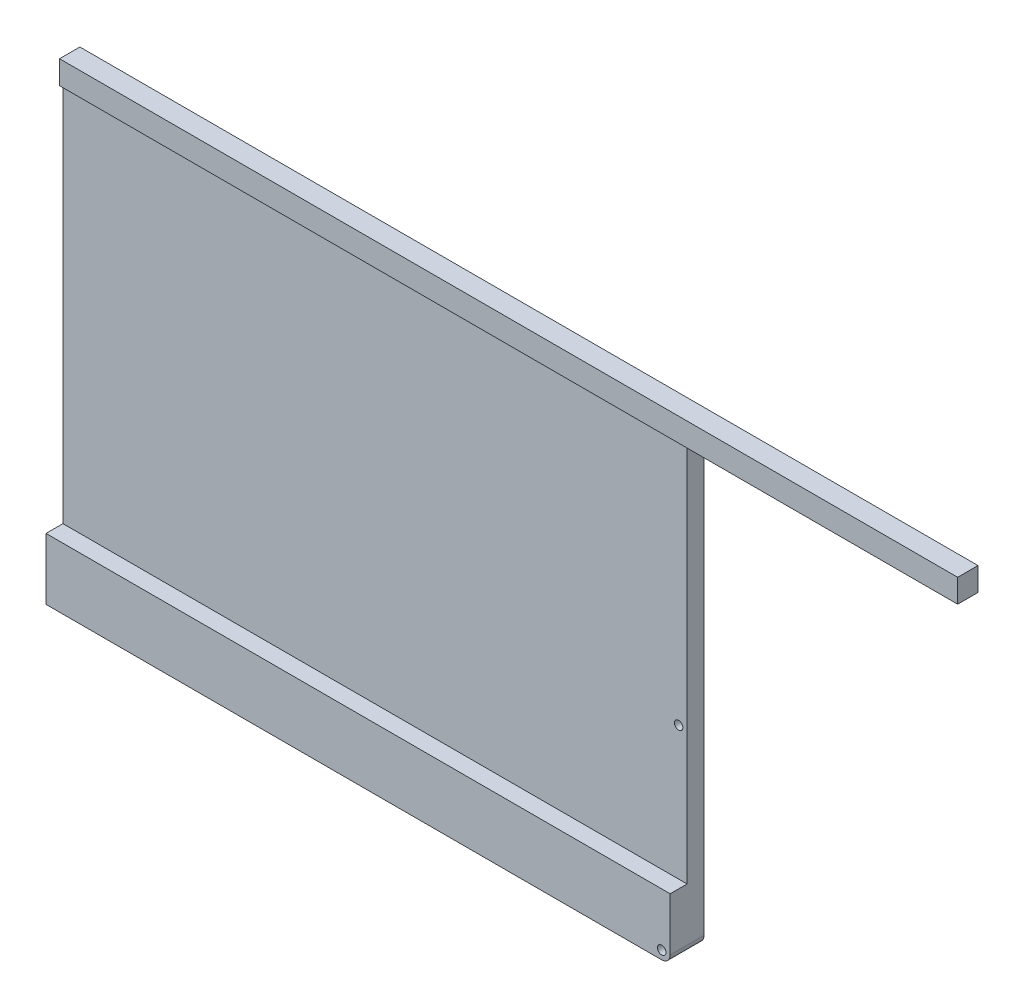
ISO-10303-21;
HEADER;
FILE_DESCRIPTION(('STEP AP214'),'2;1');
FILE_NAME('part.step','',(''),(''),'','','');
FILE_SCHEMA(('AUTOMOTIVE_DESIGN { 1 0 10303 214 1 1 1 1 }'));
ENDSEC;
DATA;
#1=APPLICATION_CONTEXT('core data for automotive mechanical design processes');
#2=APPLICATION_PROTOCOL_DEFINITION('international standard','automotive_design',2000,#1);
#3=PRODUCT_CONTEXT('',#1,'mechanical');
#4=PRODUCT('Part','Part','',(#3));
#5=PRODUCT_RELATED_PRODUCT_CATEGORY('part','',(#4));
#6=PRODUCT_DEFINITION_FORMATION('','',#4);
#7=PRODUCT_DEFINITION_CONTEXT('part definition',#1,'design');
#8=PRODUCT_DEFINITION('design','',#6,#7);
#9=PRODUCT_DEFINITION_SHAPE('','',#8);
#10=(LENGTH_UNIT() NAMED_UNIT(*) SI_UNIT(.MILLI.,.METRE.));
#11=(NAMED_UNIT(*) PLANE_ANGLE_UNIT() SI_UNIT($,.RADIAN.));
#12=(NAMED_UNIT(*) SI_UNIT($,.STERADIAN.) SOLID_ANGLE_UNIT());
#13=UNCERTAINTY_MEASURE_WITH_UNIT(LENGTH_MEASURE(1.E-05),#10,'distance_accuracy_value','');
#14=(GEOMETRIC_REPRESENTATION_CONTEXT(3) GLOBAL_UNCERTAINTY_ASSIGNED_CONTEXT((#13)) GLOBAL_UNIT_ASSIGNED_CONTEXT((#10,
#11,#12)) REPRESENTATION_CONTEXT('',''));
#15=CARTESIAN_POINT('',(0.,0.,0.));
#16=DIRECTION('',(0.,0.,1.));
#17=DIRECTION('',(1.,0.,0.));
#18=AXIS2_PLACEMENT_3D('',#15,#16,#17);
#19=CARTESIAN_POINT('',(0.,0.,0.));
#20=DIRECTION('',(0.,0.,1.));
#21=DIRECTION('',(1.,0.,0.));
#22=AXIS2_PLACEMENT_3D('',#19,#20,#21);
#23=PLANE('',#22);
#24=CARTESIAN_POINT('',(0.,110.,0.));
#25=DIRECTION('',(0.,0.,1.));
#26=DIRECTION('',(1.,0.,0.));
#27=AXIS2_PLACEMENT_3D('',#24,#25,#26);
#28=CIRCLE('',#27,2.5);
#29=CARTESIAN_POINT('',(2.5,110.,0.));
#30=VERTEX_POINT('',#29);
#31=EDGE_CURVE('E140',#30,#30,#28,.T.);
#32=ORIENTED_EDGE('',*,*,#31,.F.);
#33=EDGE_LOOP('',(#32));
#34=FACE_BOUND('',#33,.T.);
#35=DIRECTION('',(0.,-1.,0.));
#36=VECTOR('',#35,1.);
#37=CARTESIAN_POINT('',(-363.502125784835,270.,0.));
#38=LINE('',#37,#36);
#39=CARTESIAN_POINT('',(-363.502125784835,256.212106002811,0.));
#40=VERTEX_POINT('',#39);
#41=CARTESIAN_POINT('',(-363.502125784835,31.2917496201943,0.));
#42=VERTEX_POINT('',#41);
#43=EDGE_CURVE('E173',#40,#42,#38,.T.);
#44=ORIENTED_EDGE('',*,*,#43,.T.);
#45=DIRECTION('',(-1.,0.,0.));
#46=VECTOR('',#45,1.);
#47=CARTESIAN_POINT('',(-363.502125784835,31.2917496201943,0.));
#48=LINE('',#47,#46);
#49=CARTESIAN_POINT('',(4.99999999999998,31.2917496201943,0.));
#50=VERTEX_POINT('',#49);
#51=EDGE_CURVE('E138',#50,#42,#48,.T.);
#52=ORIENTED_EDGE('',*,*,#51,.F.);
#53=DIRECTION('',(0.,1.,0.));
#54=VECTOR('',#53,1.);
#55=CARTESIAN_POINT('',(5.00000000000005,256.212106002811,0.));
#56=LINE('',#55,#54);
#57=CARTESIAN_POINT('',(5.00000000000005,256.212106002811,0.));
#58=VERTEX_POINT('',#57);
#59=EDGE_CURVE('E168',#50,#58,#56,.T.);
#60=ORIENTED_EDGE('',*,*,#59,.T.);
#61=DIRECTION('',(1.,0.,0.));
#62=VECTOR('',#61,1.);
#63=CARTESIAN_POINT('',(-363.502125784835,256.212106002811,0.));
#64=LINE('',#63,#62);
#65=EDGE_CURVE('E60',#40,#58,#64,.T.);
#66=ORIENTED_EDGE('',*,*,#65,.F.);
#67=EDGE_LOOP('',(#44,#52,#60,#66));
#68=FACE_BOUND('',#67,.T.);
#69=ADVANCED_FACE('F35',(#34,#68),#23,.T.);
#70=CARTESIAN_POINT('',(0.,0.,-10.));
#71=DIRECTION('',(0.,0.,1.));
#72=DIRECTION('',(1.,0.,0.));
#73=AXIS2_PLACEMENT_3D('',#70,#71,#72);
#74=CYLINDRICAL_SURFACE('',#73,4.99999999999996);
#75=DIRECTION('',(0.,0.,1.));
#76=VECTOR('',#75,1.);
#77=CARTESIAN_POINT('',(4.99999999999996,0.,-10.));
#78=LINE('',#77,#76);
#79=CARTESIAN_POINT('',(4.99999999999996,0.,-10.));
#80=VERTEX_POINT('',#79);
#81=CARTESIAN_POINT('',(4.99999999999996,0.,10.));
#82=VERTEX_POINT('',#81);
#83=EDGE_CURVE('E188',#80,#82,#78,.T.);
#84=ORIENTED_EDGE('',*,*,#83,.T.);
#85=CARTESIAN_POINT('',(0.,0.,10.));
#86=DIRECTION('',(0.,0.,1.));
#87=DIRECTION('',(1.,0.,0.));
#88=AXIS2_PLACEMENT_3D('',#85,#86,#87);
#89=CIRCLE('',#88,4.99999999999996);
#90=CARTESIAN_POINT('',(0.,-4.99999999999998,10.));
#91=VERTEX_POINT('',#90);
#92=EDGE_CURVE('E133',#91,#82,#89,.T.);
#93=ORIENTED_EDGE('',*,*,#92,.F.);
#94=DIRECTION('',(0.,0.,1.));
#95=VECTOR('',#94,1.);
#96=CARTESIAN_POINT('',(0.,-4.99999999999998,-10.));
#97=LINE('',#96,#95);
#98=CARTESIAN_POINT('',(0.,-4.99999999999998,-10.));
#99=VERTEX_POINT('',#98);
#100=EDGE_CURVE('E11',#99,#91,#97,.T.);
#101=ORIENTED_EDGE('',*,*,#100,.F.);
#102=CARTESIAN_POINT('',(0.,0.,-10.));
#103=DIRECTION('',(0.,0.,1.));
#104=DIRECTION('',(1.,0.,0.));
#105=AXIS2_PLACEMENT_3D('',#102,#103,#104);
#106=CIRCLE('',#105,4.99999999999996);
#107=EDGE_CURVE('E169',#99,#80,#106,.T.);
#108=ORIENTED_EDGE('',*,*,#107,.T.);
#109=EDGE_LOOP('',(#84,#93,#101,#108));
#110=FACE_BOUND('',#109,.T.);
#111=ADVANCED_FACE('F37',(#110),#74,.T.);
#112=CARTESIAN_POINT('',(0.,-4.99999999999998,-10.));
#113=DIRECTION('',(0.,-1.,0.));
#114=DIRECTION('',(0.,0.,-1.));
#115=AXIS2_PLACEMENT_3D('',#112,#113,#114);
#116=PLANE('',#115);
#117=ORIENTED_EDGE('',*,*,#100,.T.);
#118=DIRECTION('',(1.,0.,0.));
#119=VECTOR('',#118,1.);
#120=CARTESIAN_POINT('',(0.,-4.99999999999998,10.));
#121=LINE('',#120,#119);
#122=CARTESIAN_POINT('',(-363.502125784835,-4.99999999999998,10.));
#123=VERTEX_POINT('',#122);
#124=EDGE_CURVE('E128',#123,#91,#121,.T.);
#125=ORIENTED_EDGE('',*,*,#124,.F.);
#126=DIRECTION('',(0.,0.,1.));
#127=VECTOR('',#126,1.);
#128=CARTESIAN_POINT('',(-363.502125784835,-4.99999999999998,-10.));
#129=LINE('',#128,#127);
#130=CARTESIAN_POINT('',(-363.502125784835,-4.99999999999998,-10.));
#131=VERTEX_POINT('',#130);
#132=EDGE_CURVE('E44',#131,#123,#129,.T.);
#133=ORIENTED_EDGE('',*,*,#132,.F.);
#134=DIRECTION('',(1.,0.,0.));
#135=VECTOR('',#134,1.);
#136=CARTESIAN_POINT('',(0.,-4.99999999999998,-10.));
#137=LINE('',#136,#135);
#138=EDGE_CURVE('E186',#131,#99,#137,.T.);
#139=ORIENTED_EDGE('',*,*,#138,.T.);
#140=EDGE_LOOP('',(#117,#125,#133,#139));
#141=FACE_BOUND('',#140,.T.);
#142=ADVANCED_FACE('F129',(#141),#116,.T.);
#143=CARTESIAN_POINT('',(-363.502125784835,270.,-10.));
#144=DIRECTION('',(-1.,0.,0.));
#145=DIRECTION('',(0.,-1.,0.));
#146=AXIS2_PLACEMENT_3D('',#143,#144,#145);
#147=PLANE('',#146);
#148=ORIENTED_EDGE('',*,*,#43,.F.);
#149=DIRECTION('',(0.,0.,-1.));
#150=VECTOR('',#149,1.);
#151=CARTESIAN_POINT('',(-363.502125784835,256.212106002811,2.));
#152=LINE('',#151,#150);
#153=CARTESIAN_POINT('',(-363.502125784835,256.212106002811,2.));
#154=VERTEX_POINT('',#153);
#155=EDGE_CURVE('E164',#154,#40,#152,.T.);
#156=ORIENTED_EDGE('',*,*,#155,.F.);
#157=DIRECTION('',(0.,-1.,0.));
#158=VECTOR('',#157,1.);
#159=CARTESIAN_POINT('',(-363.502125784835,256.212106002811,2.));
#160=LINE('',#159,#158);
#161=CARTESIAN_POINT('',(-363.502125784835,270.,2.));
#162=VERTEX_POINT('',#161);
#163=EDGE_CURVE('E152',#162,#154,#160,.T.);
#164=ORIENTED_EDGE('',*,*,#163,.F.);
#165=DIRECTION('',(0.,0.,1.));
#166=VECTOR('',#165,1.);
#167=CARTESIAN_POINT('',(-363.502125784835,270.,-10.));
#168=LINE('',#167,#166);
#169=CARTESIAN_POINT('',(-363.502125784835,270.,-10.));
#170=VERTEX_POINT('',#169);
#171=EDGE_CURVE('E125',#170,#162,#168,.T.);
#172=ORIENTED_EDGE('',*,*,#171,.F.);
#173=DIRECTION('',(0.,-1.,0.));
#174=VECTOR('',#173,1.);
#175=CARTESIAN_POINT('',(-363.502125784835,270.,-10.));
#176=LINE('',#175,#174);
#177=EDGE_CURVE('E121',#170,#131,#176,.T.);
#178=ORIENTED_EDGE('',*,*,#177,.T.);
#179=ORIENTED_EDGE('',*,*,#132,.T.);
#180=DIRECTION('',(0.,-1.,0.));
#181=VECTOR('',#180,1.);
#182=CARTESIAN_POINT('',(-363.502125784835,-4.99999999999998,10.));
#183=LINE('',#182,#181);
#184=CARTESIAN_POINT('',(-363.502125784835,31.2917496201943,10.));
#185=VERTEX_POINT('',#184);
#186=EDGE_CURVE('E119',#185,#123,#183,.T.);
#187=ORIENTED_EDGE('',*,*,#186,.F.);
#188=DIRECTION('',(0.,0.,-1.));
#189=VECTOR('',#188,1.);
#190=CARTESIAN_POINT('',(-363.502125784835,31.2917496201943,10.));
#191=LINE('',#190,#189);
#192=EDGE_CURVE('E148',#185,#42,#191,.T.);
#193=ORIENTED_EDGE('',*,*,#192,.T.);
#194=EDGE_LOOP('',(#148,#156,#164,#172,#178,#179,#187,#193));
#195=FACE_BOUND('',#194,.T.);
#196=ADVANCED_FACE('F116',(#195),#147,.T.);
#197=CARTESIAN_POINT('',(166.756532298693,270.,-10.));
#198=DIRECTION('',(0.,1.,0.));
#199=DIRECTION('',(0.,0.,1.));
#200=AXIS2_PLACEMENT_3D('',#197,#198,#199);
#201=PLANE('',#200);
#202=ORIENTED_EDGE('',*,*,#171,.T.);
#203=DIRECTION('',(-1.,0.,0.));
#204=VECTOR('',#203,1.);
#205=CARTESIAN_POINT('',(-363.502125784835,270.,2.));
#206=LINE('',#205,#204);
#207=CARTESIAN_POINT('',(166.756532298693,270.,2.));
#208=VERTEX_POINT('',#207);
#209=EDGE_CURVE('E161',#208,#162,#206,.T.);
#210=ORIENTED_EDGE('',*,*,#209,.F.);
#211=DIRECTION('',(0.,0.,1.));
#212=VECTOR('',#211,1.);
#213=CARTESIAN_POINT('',(166.756532298693,270.,-10.));
#214=LINE('',#213,#212);
#215=CARTESIAN_POINT('',(166.756532298693,270.,-10.));
#216=VERTEX_POINT('',#215);
#217=EDGE_CURVE('E192',#216,#208,#214,.T.);
#218=ORIENTED_EDGE('',*,*,#217,.F.);
#219=DIRECTION('',(-1.,0.,0.));
#220=VECTOR('',#219,1.);
#221=CARTESIAN_POINT('',(166.756532298693,270.,-10.));
#222=LINE('',#221,#220);
#223=EDGE_CURVE('E182',#216,#170,#222,.T.);
#224=ORIENTED_EDGE('',*,*,#223,.T.);
#225=EDGE_LOOP('',(#202,#210,#218,#224));
#226=FACE_BOUND('',#225,.T.);
#227=ADVANCED_FACE('F216',(#226),#201,.T.);
#228=CARTESIAN_POINT('',(166.756532298693,270.,-10.));
#229=DIRECTION('',(1.,0.,0.));
#230=DIRECTION('',(0.,0.,-1.));
#231=AXIS2_PLACEMENT_3D('',#228,#229,#230);
#232=PLANE('',#231);
#233=ORIENTED_EDGE('',*,*,#217,.T.);
#234=DIRECTION('',(0.,1.,0.));
#235=VECTOR('',#234,1.);
#236=CARTESIAN_POINT('',(166.756532298693,256.212106002811,2.));
#237=LINE('',#236,#235);
#238=CARTESIAN_POINT('',(166.756532298693,256.212106002811,2.));
#239=VERTEX_POINT('',#238);
#240=EDGE_CURVE('E158',#239,#208,#237,.T.);
#241=ORIENTED_EDGE('',*,*,#240,.F.);
#242=DIRECTION('',(0.,0.,1.));
#243=VECTOR('',#242,1.);
#244=CARTESIAN_POINT('',(166.756532298693,256.212106002811,-10.));
#245=LINE('',#244,#243);
#246=CARTESIAN_POINT('',(166.756532298693,256.212106002811,-10.));
#247=VERTEX_POINT('',#246);
#248=EDGE_CURVE('E194',#247,#239,#245,.T.);
#249=ORIENTED_EDGE('',*,*,#248,.F.);
#250=DIRECTION('',(0.,1.,0.));
#251=VECTOR('',#250,1.);
#252=CARTESIAN_POINT('',(166.756532298693,270.,-10.));
#253=LINE('',#252,#251);
#254=EDGE_CURVE('E179',#247,#216,#253,.T.);
#255=ORIENTED_EDGE('',*,*,#254,.T.);
#256=EDGE_LOOP('',(#233,#241,#249,#255));
#257=FACE_BOUND('',#256,.T.);
#258=ADVANCED_FACE('F222',(#257),#232,.T.);
#259=CARTESIAN_POINT('',(5.00000000000005,256.212106002811,-10.));
#260=DIRECTION('',(0.,-1.,0.));
#261=DIRECTION('',(0.,0.,-1.));
#262=AXIS2_PLACEMENT_3D('',#259,#260,#261);
#263=PLANE('',#262);
#264=ORIENTED_EDGE('',*,*,#248,.T.);
#265=DIRECTION('',(1.,0.,0.));
#266=VECTOR('',#265,1.);
#267=CARTESIAN_POINT('',(-363.502125784835,256.212106002811,2.));
#268=LINE('',#267,#266);
#269=EDGE_CURVE('E155',#154,#239,#268,.T.);
#270=ORIENTED_EDGE('',*,*,#269,.F.);
#271=ORIENTED_EDGE('',*,*,#155,.T.);
#272=ORIENTED_EDGE('',*,*,#65,.T.);
#273=DIRECTION('',(0.,0.,1.));
#274=VECTOR('',#273,1.);
#275=CARTESIAN_POINT('',(5.00000000000005,256.212106002811,-10.));
#276=LINE('',#275,#274);
#277=CARTESIAN_POINT('',(5.00000000000005,256.212106002811,-10.));
#278=VERTEX_POINT('',#277);
#279=EDGE_CURVE('E196',#278,#58,#276,.T.);
#280=ORIENTED_EDGE('',*,*,#279,.F.);
#281=DIRECTION('',(1.,0.,0.));
#282=VECTOR('',#281,1.);
#283=CARTESIAN_POINT('',(5.00000000000005,256.212106002811,-10.));
#284=LINE('',#283,#282);
#285=EDGE_CURVE('E176',#278,#247,#284,.T.);
#286=ORIENTED_EDGE('',*,*,#285,.T.);
#287=EDGE_LOOP('',(#264,#270,#271,#272,#280,#286));
#288=FACE_BOUND('',#287,.T.);
#289=ADVANCED_FACE('F209',(#288),#263,.T.);
#290=CARTESIAN_POINT('',(5.00000000000005,256.212106002811,-10.));
#291=DIRECTION('',(1.,0.,0.));
#292=DIRECTION('',(0.,1.,0.));
#293=AXIS2_PLACEMENT_3D('',#290,#291,#292);
#294=PLANE('',#293);
#295=ORIENTED_EDGE('',*,*,#59,.F.);
#296=DIRECTION('',(0.,0.,-1.));
#297=VECTOR('',#296,1.);
#298=CARTESIAN_POINT('',(4.99999999999996,31.2917496201943,10.));
#299=LINE('',#298,#297);
#300=CARTESIAN_POINT('',(4.99999999999996,31.2917496201943,10.));
#301=VERTEX_POINT('',#300);
#302=EDGE_CURVE('E52',#301,#50,#299,.T.);
#303=ORIENTED_EDGE('',*,*,#302,.F.);
#304=DIRECTION('',(0.,1.,0.));
#305=VECTOR('',#304,1.);
#306=CARTESIAN_POINT('',(4.99999999999996,31.2917496201943,10.));
#307=LINE('',#306,#305);
#308=EDGE_CURVE('E146',#82,#301,#307,.T.);
#309=ORIENTED_EDGE('',*,*,#308,.F.);
#310=ORIENTED_EDGE('',*,*,#83,.F.);
#311=DIRECTION('',(0.,1.,0.));
#312=VECTOR('',#311,1.);
#313=CARTESIAN_POINT('',(5.00000000000005,256.212106002811,-10.));
#314=LINE('',#313,#312);
#315=EDGE_CURVE('E172',#80,#278,#314,.T.);
#316=ORIENTED_EDGE('',*,*,#315,.T.);
#317=ORIENTED_EDGE('',*,*,#279,.T.);
#318=EDGE_LOOP('',(#295,#303,#309,#310,#316,#317));
#319=FACE_BOUND('',#318,.T.);
#320=ADVANCED_FACE('F204',(#319),#294,.T.);
#321=CARTESIAN_POINT('',(0.,0.,-10.));
#322=DIRECTION('',(0.,0.,1.));
#323=DIRECTION('',(1.,0.,0.));
#324=AXIS2_PLACEMENT_3D('',#321,#322,#323);
#325=PLANE('',#324);
#326=CARTESIAN_POINT('',(0.,110.,-10.));
#327=DIRECTION('',(0.,0.,1.));
#328=DIRECTION('',(1.,0.,0.));
#329=AXIS2_PLACEMENT_3D('',#326,#327,#328);
#330=CIRCLE('',#329,2.5);
#331=CARTESIAN_POINT('',(2.5,110.,-10.));
#332=VERTEX_POINT('',#331);
#333=EDGE_CURVE('E342',#332,#332,#330,.T.);
#334=ORIENTED_EDGE('',*,*,#333,.T.);
#335=EDGE_LOOP('',(#334));
#336=FACE_BOUND('',#335,.T.);
#337=CARTESIAN_POINT('',(0.,0.,-10.));
#338=DIRECTION('',(0.,0.,1.));
#339=DIRECTION('',(1.,0.,0.));
#340=AXIS2_PLACEMENT_3D('',#337,#338,#339);
#341=CIRCLE('',#340,2.5);
#342=CARTESIAN_POINT('',(2.5,0.,-10.));
#343=VERTEX_POINT('',#342);
#344=EDGE_CURVE('E343',#343,#343,#341,.T.);
#345=ORIENTED_EDGE('',*,*,#344,.T.);
#346=EDGE_LOOP('',(#345));
#347=FACE_BOUND('',#346,.T.);
#348=ORIENTED_EDGE('',*,*,#107,.F.);
#349=ORIENTED_EDGE('',*,*,#138,.F.);
#350=ORIENTED_EDGE('',*,*,#177,.F.);
#351=ORIENTED_EDGE('',*,*,#223,.F.);
#352=ORIENTED_EDGE('',*,*,#254,.F.);
#353=ORIENTED_EDGE('',*,*,#285,.F.);
#354=ORIENTED_EDGE('',*,*,#315,.F.);
#355=EDGE_LOOP('',(#348,#349,#350,#351,#352,#353,#354));
#356=FACE_BOUND('',#355,.T.);
#357=ADVANCED_FACE('F220',(#336,#347,#356),#325,.F.);
#358=CARTESIAN_POINT('',(0.,0.,2.));
#359=DIRECTION('',(0.,0.,-1.));
#360=DIRECTION('',(-1.,0.,0.));
#361=AXIS2_PLACEMENT_3D('',#358,#359,#360);
#362=PLANE('',#361);
#363=ORIENTED_EDGE('',*,*,#163,.T.);
#364=ORIENTED_EDGE('',*,*,#269,.T.);
#365=ORIENTED_EDGE('',*,*,#240,.T.);
#366=ORIENTED_EDGE('',*,*,#209,.T.);
#367=EDGE_LOOP('',(#363,#364,#365,#366));
#368=FACE_BOUND('',#367,.T.);
#369=ADVANCED_FACE('F212',(#368),#362,.F.);
#370=CARTESIAN_POINT('',(-363.502125784835,31.2917496201943,10.));
#371=DIRECTION('',(0.,-1.,0.));
#372=DIRECTION('',(1.,0.,0.));
#373=AXIS2_PLACEMENT_3D('',#370,#371,#372);
#374=PLANE('',#373);
#375=ORIENTED_EDGE('',*,*,#51,.T.);
#376=ORIENTED_EDGE('',*,*,#192,.F.);
#377=DIRECTION('',(-1.,0.,0.));
#378=VECTOR('',#377,1.);
#379=CARTESIAN_POINT('',(-363.502125784835,31.2917496201943,10.));
#380=LINE('',#379,#378);
#381=EDGE_CURVE('E136',#301,#185,#380,.T.);
#382=ORIENTED_EDGE('',*,*,#381,.F.);
#383=ORIENTED_EDGE('',*,*,#302,.T.);
#384=EDGE_LOOP('',(#375,#376,#382,#383));
#385=FACE_BOUND('',#384,.T.);
#386=ADVANCED_FACE('F205',(#385),#374,.F.);
#387=CARTESIAN_POINT('',(0.,0.,10.));
#388=DIRECTION('',(0.,0.,1.));
#389=DIRECTION('',(1.,0.,0.));
#390=AXIS2_PLACEMENT_3D('',#387,#388,#389);
#391=PLANE('',#390);
#392=CARTESIAN_POINT('',(0.,0.,10.));
#393=DIRECTION('',(0.,0.,1.));
#394=DIRECTION('',(1.,0.,0.));
#395=AXIS2_PLACEMENT_3D('',#392,#393,#394);
#396=CIRCLE('',#395,2.5);
#397=CARTESIAN_POINT('',(2.5,0.,10.));
#398=VERTEX_POINT('',#397);
#399=EDGE_CURVE('E39',#398,#398,#396,.T.);
#400=ORIENTED_EDGE('',*,*,#399,.F.);
#401=EDGE_LOOP('',(#400));
#402=FACE_BOUND('',#401,.T.);
#403=ORIENTED_EDGE('',*,*,#186,.T.);
#404=ORIENTED_EDGE('',*,*,#124,.T.);
#405=ORIENTED_EDGE('',*,*,#92,.T.);
#406=ORIENTED_EDGE('',*,*,#308,.T.);
#407=ORIENTED_EDGE('',*,*,#381,.T.);
#408=EDGE_LOOP('',(#403,#404,#405,#406,#407));
#409=FACE_BOUND('',#408,.T.);
#410=ADVANCED_FACE('F135',(#402,#409),#391,.T.);
#411=CARTESIAN_POINT('',(0.,0.,-10.));
#412=DIRECTION('',(0.,0.,1.));
#413=DIRECTION('',(1.,0.,0.));
#414=AXIS2_PLACEMENT_3D('',#411,#412,#413);
#415=CYLINDRICAL_SURFACE('',#414,2.5);
#416=ORIENTED_EDGE('',*,*,#399,.T.);
#417=EDGE_LOOP('',(#416));
#418=FACE_BOUND('',#417,.T.);
#419=ORIENTED_EDGE('',*,*,#344,.F.);
#420=EDGE_LOOP('',(#419));
#421=FACE_BOUND('',#420,.T.);
#422=ADVANCED_FACE('F316',(#418,#421),#415,.F.);
#423=CARTESIAN_POINT('',(0.,110.,-10.));
#424=DIRECTION('',(0.,0.,1.));
#425=DIRECTION('',(1.,0.,0.));
#426=AXIS2_PLACEMENT_3D('',#423,#424,#425);
#427=CYLINDRICAL_SURFACE('',#426,2.5);
#428=ORIENTED_EDGE('',*,*,#31,.T.);
#429=EDGE_LOOP('',(#428));
#430=FACE_BOUND('',#429,.T.);
#431=ORIENTED_EDGE('',*,*,#333,.F.);
#432=EDGE_LOOP('',(#431));
#433=FACE_BOUND('',#432,.T.);
#434=ADVANCED_FACE('F326',(#430,#433),#427,.F.);
#435=CLOSED_SHELL('',(#69,#111,#142,#196,#227,#258,#289,#320,#357,#369,#386,#410,#422,#434));
#436=MANIFOLD_SOLID_BREP('B2',#435);
#437=ADVANCED_BREP_SHAPE_REPRESENTATION('',(#18,#436),#14);
#438=SHAPE_DEFINITION_REPRESENTATION(#9,#437);
ENDSEC;
END-ISO-10303-21;
